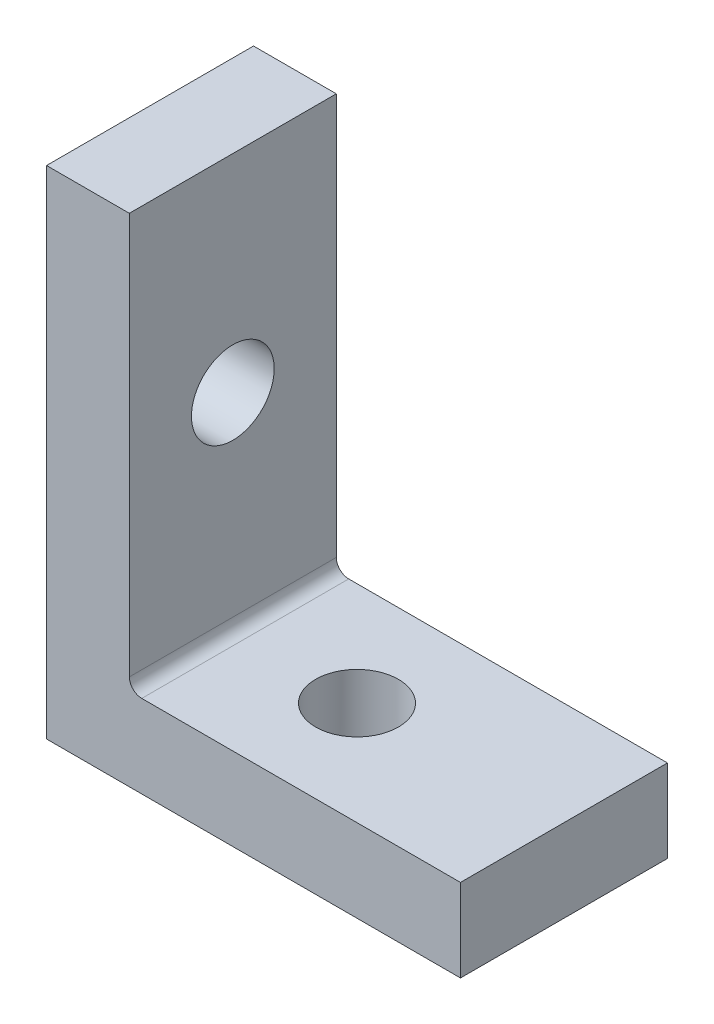
ISO-10303-21;
HEADER;
FILE_DESCRIPTION(('STEP AP214'),'2;1');
FILE_NAME('part.step','',(''),(''),'','','');
FILE_SCHEMA(('AUTOMOTIVE_DESIGN { 1 0 10303 214 1 1 1 1 }'));
ENDSEC;
DATA;
#1=APPLICATION_CONTEXT('core data for automotive mechanical design processes');
#2=APPLICATION_PROTOCOL_DEFINITION('international standard','automotive_design',2000,#1);
#3=PRODUCT_CONTEXT('',#1,'mechanical');
#4=PRODUCT('Part','Part','',(#3));
#5=PRODUCT_RELATED_PRODUCT_CATEGORY('part','',(#4));
#6=PRODUCT_DEFINITION_FORMATION('','',#4);
#7=PRODUCT_DEFINITION_CONTEXT('part definition',#1,'design');
#8=PRODUCT_DEFINITION('design','',#6,#7);
#9=PRODUCT_DEFINITION_SHAPE('','',#8);
#10=(LENGTH_UNIT() NAMED_UNIT(*) SI_UNIT(.MILLI.,.METRE.));
#11=(NAMED_UNIT(*) PLANE_ANGLE_UNIT() SI_UNIT($,.RADIAN.));
#12=(NAMED_UNIT(*) SI_UNIT($,.STERADIAN.) SOLID_ANGLE_UNIT());
#13=UNCERTAINTY_MEASURE_WITH_UNIT(LENGTH_MEASURE(1.E-05),#10,'distance_accuracy_value','');
#14=(GEOMETRIC_REPRESENTATION_CONTEXT(3) GLOBAL_UNCERTAINTY_ASSIGNED_CONTEXT((#13)) GLOBAL_UNIT_ASSIGNED_CONTEXT((#10,
#11,#12)) REPRESENTATION_CONTEXT('',''));
#15=CARTESIAN_POINT('',(0.,0.,0.));
#16=DIRECTION('',(0.,0.,1.));
#17=DIRECTION('',(1.,0.,0.));
#18=AXIS2_PLACEMENT_3D('',#15,#16,#17);
#19=CARTESIAN_POINT('',(0.,20.,0.));
#20=DIRECTION('',(0.,-1.,0.));
#21=DIRECTION('',(0.,0.,-1.));
#22=AXIS2_PLACEMENT_3D('',#19,#20,#21);
#23=PLANE('',#22);
#24=CARTESIAN_POINT('',(0.,20.,0.));
#25=DIRECTION('',(0.,1.,0.));
#26=DIRECTION('',(0.,0.,1.));
#27=AXIS2_PLACEMENT_3D('',#24,#25,#26);
#28=CIRCLE('',#27,10.);
#29=CARTESIAN_POINT('',(0.,20.,10.));
#30=VERTEX_POINT('',#29);
#31=EDGE_CURVE('E184',#30,#30,#28,.T.);
#32=ORIENTED_EDGE('',*,*,#31,.F.);
#33=EDGE_LOOP('',(#32));
#34=FACE_BOUND('',#33,.T.);
#35=DIRECTION('',(-1.,0.,0.));
#36=VECTOR('',#35,1.);
#37=CARTESIAN_POINT('',(-50.,20.,-25.));
#38=LINE('',#37,#36);
#39=CARTESIAN_POINT('',(50.,20.,-25.));
#40=VERTEX_POINT('',#39);
#41=CARTESIAN_POINT('',(-27.,20.,-25.));
#42=VERTEX_POINT('',#41);
#43=EDGE_CURVE('E153',#40,#42,#38,.T.);
#44=ORIENTED_EDGE('',*,*,#43,.T.);
#45=DIRECTION('',(0.,0.,-1.));
#46=VECTOR('',#45,1.);
#47=CARTESIAN_POINT('',(-27.,20.,25.));
#48=LINE('',#47,#46);
#49=CARTESIAN_POINT('',(-27.,20.,25.));
#50=VERTEX_POINT('',#49);
#51=EDGE_CURVE('E66',#42,#50,#48,.F.);
#52=ORIENTED_EDGE('',*,*,#51,.T.);
#53=DIRECTION('',(1.,0.,0.));
#54=VECTOR('',#53,1.);
#55=CARTESIAN_POINT('',(-50.,20.,25.));
#56=LINE('',#55,#54);
#57=CARTESIAN_POINT('',(50.,20.,25.));
#58=VERTEX_POINT('',#57);
#59=EDGE_CURVE('E157',#50,#58,#56,.T.);
#60=ORIENTED_EDGE('',*,*,#59,.T.);
#61=DIRECTION('',(0.,0.,-1.));
#62=VECTOR('',#61,1.);
#63=CARTESIAN_POINT('',(50.,20.,25.));
#64=LINE('',#63,#62);
#65=EDGE_CURVE('E149',#58,#40,#64,.T.);
#66=ORIENTED_EDGE('',*,*,#65,.T.);
#67=EDGE_LOOP('',(#44,#52,#60,#66));
#68=FACE_BOUND('',#67,.T.);
#69=ADVANCED_FACE('F44',(#34,#68),#23,.F.);
#70=CARTESIAN_POINT('',(50.,20.,25.));
#71=DIRECTION('',(-1.,0.,0.));
#72=DIRECTION('',(0.,0.,1.));
#73=AXIS2_PLACEMENT_3D('',#70,#71,#72);
#74=PLANE('',#73);
#75=DIRECTION('',(0.,0.,-1.));
#76=VECTOR('',#75,1.);
#77=CARTESIAN_POINT('',(50.,0.,25.));
#78=LINE('',#77,#76);
#79=CARTESIAN_POINT('',(50.,0.,25.));
#80=VERTEX_POINT('',#79);
#81=CARTESIAN_POINT('',(50.,0.,-25.));
#82=VERTEX_POINT('',#81);
#83=EDGE_CURVE('E148',#80,#82,#78,.T.);
#84=ORIENTED_EDGE('',*,*,#83,.T.);
#85=DIRECTION('',(0.,-1.,0.));
#86=VECTOR('',#85,1.);
#87=CARTESIAN_POINT('',(50.,20.,-25.));
#88=LINE('',#87,#86);
#89=EDGE_CURVE('E175',#40,#82,#88,.T.);
#90=ORIENTED_EDGE('',*,*,#89,.F.);
#91=ORIENTED_EDGE('',*,*,#65,.F.);
#92=DIRECTION('',(0.,-1.,0.));
#93=VECTOR('',#92,1.);
#94=CARTESIAN_POINT('',(50.,20.,25.));
#95=LINE('',#94,#93);
#96=EDGE_CURVE('E114',#58,#80,#95,.T.);
#97=ORIENTED_EDGE('',*,*,#96,.T.);
#98=EDGE_LOOP('',(#84,#90,#91,#97));
#99=FACE_BOUND('',#98,.T.);
#100=ADVANCED_FACE('F203',(#99),#74,.F.);
#101=CARTESIAN_POINT('',(-50.,20.,-25.));
#102=DIRECTION('',(0.,0.,1.));
#103=DIRECTION('',(1.,0.,0.));
#104=AXIS2_PLACEMENT_3D('',#101,#102,#103);
#105=PLANE('',#104);
#106=DIRECTION('',(-1.,0.,0.));
#107=VECTOR('',#106,1.);
#108=CARTESIAN_POINT('',(-50.,0.,-25.));
#109=LINE('',#108,#107);
#110=CARTESIAN_POINT('',(-50.,0.,-25.));
#111=VERTEX_POINT('',#110);
#112=EDGE_CURVE('E163',#82,#111,#109,.T.);
#113=ORIENTED_EDGE('',*,*,#112,.T.);
#114=DIRECTION('',(0.,-1.,0.));
#115=VECTOR('',#114,1.);
#116=CARTESIAN_POINT('',(-50.,20.,-25.));
#117=LINE('',#116,#115);
#118=CARTESIAN_POINT('',(-50.,120.,-25.));
#119=VERTEX_POINT('',#118);
#120=EDGE_CURVE('E113',#119,#111,#117,.T.);
#121=ORIENTED_EDGE('',*,*,#120,.F.);
#122=DIRECTION('',(-1.,0.,0.));
#123=VECTOR('',#122,1.);
#124=CARTESIAN_POINT('',(-50.,120.,-25.));
#125=LINE('',#124,#123);
#126=CARTESIAN_POINT('',(-30.,120.,-25.));
#127=VERTEX_POINT('',#126);
#128=EDGE_CURVE('E129',#127,#119,#125,.T.);
#129=ORIENTED_EDGE('',*,*,#128,.F.);
#130=DIRECTION('',(0.,-1.,0.));
#131=VECTOR('',#130,1.);
#132=CARTESIAN_POINT('',(-30.,120.,-25.));
#133=LINE('',#132,#131);
#134=CARTESIAN_POINT('',(-30.,23.,-25.));
#135=VERTEX_POINT('',#134);
#136=EDGE_CURVE('E143',#127,#135,#133,.T.);
#137=ORIENTED_EDGE('',*,*,#136,.T.);
#138=CARTESIAN_POINT('',(-27.,23.,-25.));
#139=DIRECTION('',(0.,0.,1.));
#140=DIRECTION('',(1.,0.,0.));
#141=AXIS2_PLACEMENT_3D('',#138,#139,#140);
#142=CIRCLE('',#141,3.);
#143=EDGE_CURVE('E53',#135,#42,#142,.T.);
#144=ORIENTED_EDGE('',*,*,#143,.T.);
#145=ORIENTED_EDGE('',*,*,#43,.F.);
#146=ORIENTED_EDGE('',*,*,#89,.T.);
#147=EDGE_LOOP('',(#113,#121,#129,#137,#144,#145,#146));
#148=FACE_BOUND('',#147,.T.);
#149=ADVANCED_FACE('F196',(#148),#105,.F.);
#150=CARTESIAN_POINT('',(-50.,20.,25.));
#151=DIRECTION('',(1.,0.,0.));
#152=DIRECTION('',(0.,0.,-1.));
#153=AXIS2_PLACEMENT_3D('',#150,#151,#152);
#154=PLANE('',#153);
#155=CARTESIAN_POINT('',(-50.,70.,0.));
#156=DIRECTION('',(1.,0.,0.));
#157=DIRECTION('',(0.,0.,-1.));
#158=AXIS2_PLACEMENT_3D('',#155,#156,#157);
#159=CIRCLE('',#158,10.);
#160=CARTESIAN_POINT('',(-50.,70.,-9.99999999999999));
#161=VERTEX_POINT('',#160);
#162=EDGE_CURVE('E131',#161,#161,#159,.T.);
#163=ORIENTED_EDGE('',*,*,#162,.T.);
#164=EDGE_LOOP('',(#163));
#165=FACE_BOUND('',#164,.T.);
#166=DIRECTION('',(0.,0.,1.));
#167=VECTOR('',#166,1.);
#168=CARTESIAN_POINT('',(-50.,0.,25.));
#169=LINE('',#168,#167);
#170=CARTESIAN_POINT('',(-50.,0.,25.));
#171=VERTEX_POINT('',#170);
#172=EDGE_CURVE('E109',#111,#171,#169,.T.);
#173=ORIENTED_EDGE('',*,*,#172,.T.);
#174=DIRECTION('',(0.,-1.,0.));
#175=VECTOR('',#174,1.);
#176=CARTESIAN_POINT('',(-50.,20.,25.));
#177=LINE('',#176,#175);
#178=CARTESIAN_POINT('',(-50.,120.,25.));
#179=VERTEX_POINT('',#178);
#180=EDGE_CURVE('E102',#179,#171,#177,.T.);
#181=ORIENTED_EDGE('',*,*,#180,.F.);
#182=DIRECTION('',(0.,0.,1.));
#183=VECTOR('',#182,1.);
#184=CARTESIAN_POINT('',(-50.,120.,-25.));
#185=LINE('',#184,#183);
#186=EDGE_CURVE('E107',#119,#179,#185,.T.);
#187=ORIENTED_EDGE('',*,*,#186,.F.);
#188=ORIENTED_EDGE('',*,*,#120,.T.);
#189=EDGE_LOOP('',(#173,#181,#187,#188));
#190=FACE_BOUND('',#189,.T.);
#191=ADVANCED_FACE('F104',(#165,#190),#154,.F.);
#192=CARTESIAN_POINT('',(-50.,20.,25.));
#193=DIRECTION('',(0.,0.,-1.));
#194=DIRECTION('',(-1.,0.,0.));
#195=AXIS2_PLACEMENT_3D('',#192,#193,#194);
#196=PLANE('',#195);
#197=DIRECTION('',(1.,0.,0.));
#198=VECTOR('',#197,1.);
#199=CARTESIAN_POINT('',(-50.,0.,25.));
#200=LINE('',#199,#198);
#201=EDGE_CURVE('E154',#171,#80,#200,.T.);
#202=ORIENTED_EDGE('',*,*,#201,.T.);
#203=ORIENTED_EDGE('',*,*,#96,.F.);
#204=ORIENTED_EDGE('',*,*,#59,.F.);
#205=CARTESIAN_POINT('',(-27.,23.,25.));
#206=DIRECTION('',(0.,0.,-1.));
#207=DIRECTION('',(-1.,0.,0.));
#208=AXIS2_PLACEMENT_3D('',#205,#206,#207);
#209=CIRCLE('',#208,3.);
#210=CARTESIAN_POINT('',(-30.,23.,25.));
#211=VERTEX_POINT('',#210);
#212=EDGE_CURVE('E11',#50,#211,#209,.T.);
#213=ORIENTED_EDGE('',*,*,#212,.T.);
#214=DIRECTION('',(0.,-1.,0.));
#215=VECTOR('',#214,1.);
#216=CARTESIAN_POINT('',(-30.,120.,25.));
#217=LINE('',#216,#215);
#218=CARTESIAN_POINT('',(-30.,120.,25.));
#219=VERTEX_POINT('',#218);
#220=EDGE_CURVE('E120',#219,#211,#217,.T.);
#221=ORIENTED_EDGE('',*,*,#220,.F.);
#222=DIRECTION('',(1.,0.,0.));
#223=VECTOR('',#222,1.);
#224=CARTESIAN_POINT('',(-50.,120.,25.));
#225=LINE('',#224,#223);
#226=EDGE_CURVE('E117',#179,#219,#225,.T.);
#227=ORIENTED_EDGE('',*,*,#226,.F.);
#228=ORIENTED_EDGE('',*,*,#180,.T.);
#229=EDGE_LOOP('',(#202,#203,#204,#213,#221,#227,#228));
#230=FACE_BOUND('',#229,.T.);
#231=ADVANCED_FACE('F118',(#230),#196,.F.);
#232=CARTESIAN_POINT('',(0.,0.,0.));
#233=DIRECTION('',(0.,-1.,0.));
#234=DIRECTION('',(0.,0.,-1.));
#235=AXIS2_PLACEMENT_3D('',#232,#233,#234);
#236=PLANE('',#235);
#237=CARTESIAN_POINT('',(0.,0.,0.));
#238=DIRECTION('',(0.,-1.,0.));
#239=DIRECTION('',(0.,0.,-1.));
#240=AXIS2_PLACEMENT_3D('',#237,#238,#239);
#241=CIRCLE('',#240,10.);
#242=CARTESIAN_POINT('',(0.,0.,-10.));
#243=VERTEX_POINT('',#242);
#244=EDGE_CURVE('E180',#243,#243,#241,.T.);
#245=ORIENTED_EDGE('',*,*,#244,.F.);
#246=EDGE_LOOP('',(#245));
#247=FACE_BOUND('',#246,.T.);
#248=ORIENTED_EDGE('',*,*,#83,.F.);
#249=ORIENTED_EDGE('',*,*,#201,.F.);
#250=ORIENTED_EDGE('',*,*,#172,.F.);
#251=ORIENTED_EDGE('',*,*,#112,.F.);
#252=EDGE_LOOP('',(#248,#249,#250,#251));
#253=FACE_BOUND('',#252,.T.);
#254=ADVANCED_FACE('F199',(#247,#253),#236,.T.);
#255=CARTESIAN_POINT('',(-30.,120.,-25.));
#256=DIRECTION('',(-1.,0.,0.));
#257=DIRECTION('',(0.,0.,1.));
#258=AXIS2_PLACEMENT_3D('',#255,#256,#257);
#259=PLANE('',#258);
#260=CARTESIAN_POINT('',(-30.,70.,0.));
#261=DIRECTION('',(1.,0.,0.));
#262=DIRECTION('',(0.,0.,-1.));
#263=AXIS2_PLACEMENT_3D('',#260,#261,#262);
#264=CIRCLE('',#263,10.);
#265=CARTESIAN_POINT('',(-30.,70.,-10.));
#266=VERTEX_POINT('',#265);
#267=EDGE_CURVE('E135',#266,#266,#264,.T.);
#268=ORIENTED_EDGE('',*,*,#267,.F.);
#269=EDGE_LOOP('',(#268));
#270=FACE_BOUND('',#269,.T.);
#271=ORIENTED_EDGE('',*,*,#220,.T.);
#272=DIRECTION('',(0.,0.,-1.));
#273=VECTOR('',#272,1.);
#274=CARTESIAN_POINT('',(-30.,23.,-25.));
#275=LINE('',#274,#273);
#276=EDGE_CURVE('E179',#211,#135,#275,.T.);
#277=ORIENTED_EDGE('',*,*,#276,.T.);
#278=ORIENTED_EDGE('',*,*,#136,.F.);
#279=DIRECTION('',(0.,0.,-1.));
#280=VECTOR('',#279,1.);
#281=CARTESIAN_POINT('',(-30.,120.,-25.));
#282=LINE('',#281,#280);
#283=EDGE_CURVE('E124',#219,#127,#282,.T.);
#284=ORIENTED_EDGE('',*,*,#283,.F.);
#285=EDGE_LOOP('',(#271,#277,#278,#284));
#286=FACE_BOUND('',#285,.T.);
#287=ADVANCED_FACE('F193',(#270,#286),#259,.F.);
#288=CARTESIAN_POINT('',(0.,120.,0.));
#289=DIRECTION('',(0.,1.,0.));
#290=DIRECTION('',(0.,0.,1.));
#291=AXIS2_PLACEMENT_3D('',#288,#289,#290);
#292=PLANE('',#291);
#293=ORIENTED_EDGE('',*,*,#186,.T.);
#294=ORIENTED_EDGE('',*,*,#226,.T.);
#295=ORIENTED_EDGE('',*,*,#283,.T.);
#296=ORIENTED_EDGE('',*,*,#128,.T.);
#297=EDGE_LOOP('',(#293,#294,#295,#296));
#298=FACE_BOUND('',#297,.T.);
#299=ADVANCED_FACE('F127',(#298),#292,.T.);
#300=CARTESIAN_POINT('',(-130.,70.,0.));
#301=DIRECTION('',(1.,0.,0.));
#302=DIRECTION('',(0.,0.,-1.));
#303=AXIS2_PLACEMENT_3D('',#300,#301,#302);
#304=CYLINDRICAL_SURFACE('',#303,10.);
#305=ORIENTED_EDGE('',*,*,#267,.T.);
#306=EDGE_LOOP('',(#305));
#307=FACE_BOUND('',#306,.T.);
#308=ORIENTED_EDGE('',*,*,#162,.F.);
#309=EDGE_LOOP('',(#308));
#310=FACE_BOUND('',#309,.T.);
#311=ADVANCED_FACE('F211',(#307,#310),#304,.F.);
#312=CARTESIAN_POINT('',(0.,-80.,0.));
#313=DIRECTION('',(0.,1.,0.));
#314=DIRECTION('',(0.,0.,1.));
#315=AXIS2_PLACEMENT_3D('',#312,#313,#314);
#316=CYLINDRICAL_SURFACE('',#315,10.);
#317=ORIENTED_EDGE('',*,*,#244,.T.);
#318=EDGE_LOOP('',(#317));
#319=FACE_BOUND('',#318,.T.);
#320=ORIENTED_EDGE('',*,*,#31,.T.);
#321=EDGE_LOOP('',(#320));
#322=FACE_BOUND('',#321,.T.);
#323=ADVANCED_FACE('F206',(#319,#322),#316,.F.);
#324=CARTESIAN_POINT('',(-27.,23.,-25.));
#325=DIRECTION('',(0.,0.,1.));
#326=DIRECTION('',(1.,0.,0.));
#327=AXIS2_PLACEMENT_3D('',#324,#325,#326);
#328=CYLINDRICAL_SURFACE('',#327,3.);
#329=ORIENTED_EDGE('',*,*,#212,.F.);
#330=ORIENTED_EDGE('',*,*,#51,.F.);
#331=ORIENTED_EDGE('',*,*,#143,.F.);
#332=ORIENTED_EDGE('',*,*,#276,.F.);
#333=EDGE_LOOP('',(#329,#330,#331,#332));
#334=FACE_BOUND('',#333,.T.);
#335=ADVANCED_FACE('F46',(#334),#328,.F.);
#336=CLOSED_SHELL('',(#69,#100,#149,#191,#231,#254,#287,#299,#311,#323,#335));
#337=MANIFOLD_SOLID_BREP('B2',#336);
#338=ADVANCED_BREP_SHAPE_REPRESENTATION('',(#18,#337),#14);
#339=SHAPE_DEFINITION_REPRESENTATION(#9,#338);
ENDSEC;
END-ISO-10303-21;
